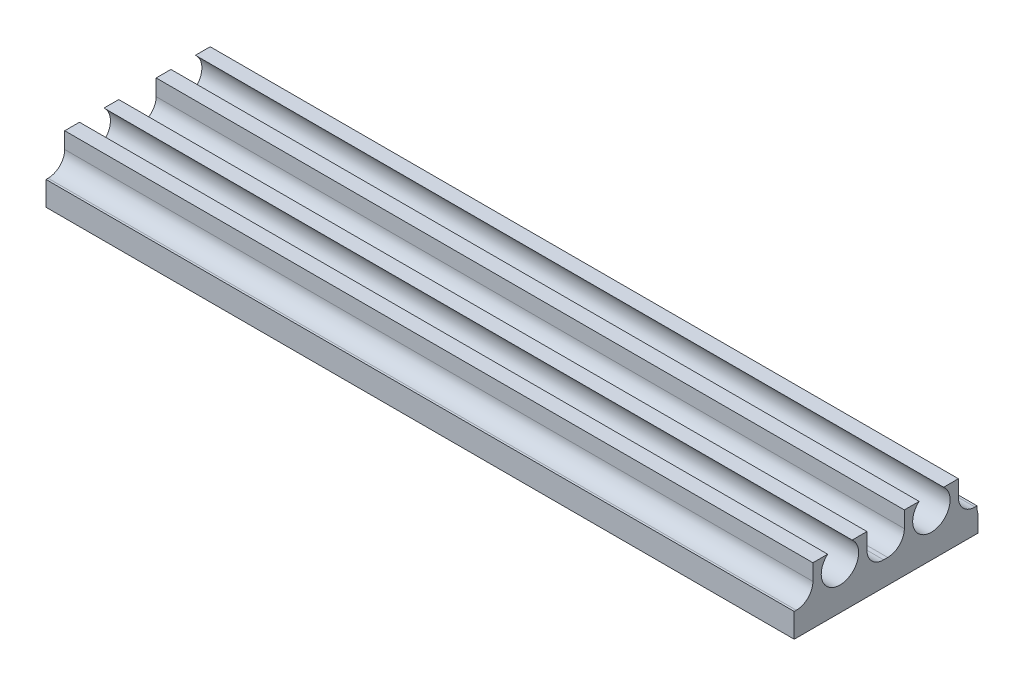
ISO-10303-21;
HEADER;
FILE_DESCRIPTION(('STEP AP214'),'2;1');
FILE_NAME('part.step','',(''),(''),'','','');
FILE_SCHEMA(('AUTOMOTIVE_DESIGN { 1 0 10303 214 1 1 1 1 }'));
ENDSEC;
DATA;
#1=APPLICATION_CONTEXT('core data for automotive mechanical design processes');
#2=APPLICATION_PROTOCOL_DEFINITION('international standard','automotive_design',2000,#1);
#3=PRODUCT_CONTEXT('',#1,'mechanical');
#4=PRODUCT('Part','Part','',(#3));
#5=PRODUCT_RELATED_PRODUCT_CATEGORY('part','',(#4));
#6=PRODUCT_DEFINITION_FORMATION('','',#4);
#7=PRODUCT_DEFINITION_CONTEXT('part definition',#1,'design');
#8=PRODUCT_DEFINITION('design','',#6,#7);
#9=PRODUCT_DEFINITION_SHAPE('','',#8);
#10=(LENGTH_UNIT() NAMED_UNIT(*) SI_UNIT(.MILLI.,.METRE.));
#11=(NAMED_UNIT(*) PLANE_ANGLE_UNIT() SI_UNIT($,.RADIAN.));
#12=(NAMED_UNIT(*) SI_UNIT($,.STERADIAN.) SOLID_ANGLE_UNIT());
#13=UNCERTAINTY_MEASURE_WITH_UNIT(LENGTH_MEASURE(1.E-05),#10,'distance_accuracy_value','');
#14=(GEOMETRIC_REPRESENTATION_CONTEXT(3) GLOBAL_UNCERTAINTY_ASSIGNED_CONTEXT((#13)) GLOBAL_UNIT_ASSIGNED_CONTEXT((#10,
#11,#12)) REPRESENTATION_CONTEXT('',''));
#15=CARTESIAN_POINT('',(0.,0.,0.));
#16=DIRECTION('',(0.,0.,1.));
#17=DIRECTION('',(1.,0.,0.));
#18=AXIS2_PLACEMENT_3D('',#15,#16,#17);
#19=CARTESIAN_POINT('',(0.,-25.7499999999933,-5.49999999999999));
#20=DIRECTION('',(1.,0.,0.));
#21=DIRECTION('',(0.,0.,-1.));
#22=AXIS2_PLACEMENT_3D('',#19,#20,#21);
#23=PLANE('',#22);
#24=CARTESIAN_POINT('',(0.,23.25,-13.));
#25=DIRECTION('',(1.,0.,0.));
#26=DIRECTION('',(0.,0.,-1.));
#27=AXIS2_PLACEMENT_3D('',#24,#25,#26);
#28=CIRCLE('',#27,2.);
#29=CARTESIAN_POINT('',(0.,23.25,-11.));
#30=VERTEX_POINT('',#29);
#31=CARTESIAN_POINT('',(0.,22.6,-11.1085719680622));
#32=VERTEX_POINT('',#31);
#33=EDGE_CURVE('E205',#30,#32,#28,.T.);
#34=ORIENTED_EDGE('',*,*,#33,.T.);
#35=DIRECTION('',(0.,1.,0.));
#36=VECTOR('',#35,1.);
#37=CARTESIAN_POINT('',(0.,20.6,-11.1085719680622));
#38=LINE('',#37,#36);
#39=CARTESIAN_POINT('',(0.,20.6,-11.1085719680622));
#40=VERTEX_POINT('',#39);
#41=EDGE_CURVE('E186',#40,#32,#38,.T.);
#42=ORIENTED_EDGE('',*,*,#41,.F.);
#43=DIRECTION('',(0.,0.,-1.));
#44=VECTOR('',#43,1.);
#45=CARTESIAN_POINT('',(0.,20.6,11.));
#46=LINE('',#45,#44);
#47=CARTESIAN_POINT('',(0.,20.6,11.));
#48=VERTEX_POINT('',#47);
#49=EDGE_CURVE('E193',#48,#40,#46,.T.);
#50=ORIENTED_EDGE('',*,*,#49,.F.);
#51=DIRECTION('',(0.,-1.,0.));
#52=VECTOR('',#51,1.);
#53=CARTESIAN_POINT('',(0.,27.4500000000069,11.));
#54=LINE('',#53,#52);
#55=CARTESIAN_POINT('',(0.,23.5,11.));
#56=VERTEX_POINT('',#55);
#57=EDGE_CURVE('E226',#56,#48,#54,.T.);
#58=ORIENTED_EDGE('',*,*,#57,.F.);
#59=DIRECTION('',(0.,0.,1.));
#60=VECTOR('',#59,1.);
#61=CARTESIAN_POINT('',(0.,23.5,8.75));
#62=LINE('',#61,#60);
#63=CARTESIAN_POINT('',(0.,23.5,10.75));
#64=VERTEX_POINT('',#63);
#65=EDGE_CURVE('E237',#64,#56,#62,.T.);
#66=ORIENTED_EDGE('',*,*,#65,.F.);
#67=CARTESIAN_POINT('',(0.,25.5,10.75));
#68=DIRECTION('',(1.,0.,0.));
#69=DIRECTION('',(0.,0.,-1.));
#70=AXIS2_PLACEMENT_3D('',#67,#68,#69);
#71=CIRCLE('',#70,2.);
#72=CARTESIAN_POINT('',(0.,25.5,8.74999999999999));
#73=VERTEX_POINT('',#72);
#74=EDGE_CURVE('E311',#64,#73,#71,.T.);
#75=ORIENTED_EDGE('',*,*,#74,.T.);
#76=DIRECTION('',(0.,-1.,0.));
#77=VECTOR('',#76,1.);
#78=CARTESIAN_POINT('',(0.,27.45,8.74999999999999));
#79=LINE('',#78,#77);
#80=CARTESIAN_POINT('',(0.,27.45,8.74999999999999));
#81=VERTEX_POINT('',#80);
#82=EDGE_CURVE('E232',#81,#73,#79,.T.);
#83=ORIENTED_EDGE('',*,*,#82,.F.);
#84=DIRECTION('',(0.,0.,1.));
#85=VECTOR('',#84,1.);
#86=CARTESIAN_POINT('',(0.,27.4500000000069,11.));
#87=LINE('',#86,#85);
#88=CARTESIAN_POINT('',(0.,27.4500000000069,6.97394029729037));
#89=VERTEX_POINT('',#88);
#90=EDGE_CURVE('E288',#89,#81,#87,.T.);
#91=ORIENTED_EDGE('',*,*,#90,.F.);
#92=CARTESIAN_POINT('',(0.,25.75,5.5));
#93=DIRECTION('',(-1.,0.,0.));
#94=DIRECTION('',(0.,0.,1.));
#95=AXIS2_PLACEMENT_3D('',#92,#93,#94);
#96=CIRCLE('',#95,2.25);
#97=CARTESIAN_POINT('',(0.,27.4500000000069,4.02605970270962));
#98=VERTEX_POINT('',#97);
#99=EDGE_CURVE('E220',#98,#89,#96,.T.);
#100=ORIENTED_EDGE('',*,*,#99,.F.);
#101=CARTESIAN_POINT('',(0.,27.45,2.25));
#102=VERTEX_POINT('',#101);
#103=EDGE_CURVE('E295',#102,#98,#87,.T.);
#104=ORIENTED_EDGE('',*,*,#103,.F.);
#105=DIRECTION('',(0.,1.,0.));
#106=VECTOR('',#105,1.);
#107=CARTESIAN_POINT('',(0.,23.5,2.25));
#108=LINE('',#107,#106);
#109=CARTESIAN_POINT('',(0.,25.5,2.25));
#110=VERTEX_POINT('',#109);
#111=EDGE_CURVE('E253',#110,#102,#108,.T.);
#112=ORIENTED_EDGE('',*,*,#111,.F.);
#113=CARTESIAN_POINT('',(0.,25.5,0.250000000000001));
#114=DIRECTION('',(1.,0.,0.));
#115=DIRECTION('',(0.,0.,-1.));
#116=AXIS2_PLACEMENT_3D('',#113,#114,#115);
#117=CIRCLE('',#116,2.);
#118=CARTESIAN_POINT('',(0.,23.5,0.250000000000001));
#119=VERTEX_POINT('',#118);
#120=EDGE_CURVE('E55',#110,#119,#117,.T.);
#121=ORIENTED_EDGE('',*,*,#120,.T.);
#122=DIRECTION('',(0.,0.,1.));
#123=VECTOR('',#122,1.);
#124=CARTESIAN_POINT('',(0.,23.5,-2.25000000000001));
#125=LINE('',#124,#123);
#126=CARTESIAN_POINT('',(0.,23.5,-0.250000000000011));
#127=VERTEX_POINT('',#126);
#128=EDGE_CURVE('E260',#127,#119,#125,.T.);
#129=ORIENTED_EDGE('',*,*,#128,.F.);
#130=CARTESIAN_POINT('',(0.,25.5,-0.250000000000011));
#131=DIRECTION('',(1.,0.,0.));
#132=DIRECTION('',(0.,0.,-1.));
#133=AXIS2_PLACEMENT_3D('',#130,#131,#132);
#134=CIRCLE('',#133,2.);
#135=CARTESIAN_POINT('',(0.,25.5,-2.25000000000001));
#136=VERTEX_POINT('',#135);
#137=EDGE_CURVE('E339',#127,#136,#134,.T.);
#138=ORIENTED_EDGE('',*,*,#137,.T.);
#139=DIRECTION('',(0.,-1.,0.));
#140=VECTOR('',#139,1.);
#141=CARTESIAN_POINT('',(0.,27.45,-2.25000000000001));
#142=LINE('',#141,#140);
#143=CARTESIAN_POINT('',(0.,27.45,-2.25000000000001));
#144=VERTEX_POINT('',#143);
#145=EDGE_CURVE('E246',#144,#136,#142,.T.);
#146=ORIENTED_EDGE('',*,*,#145,.F.);
#147=CARTESIAN_POINT('',(0.,27.4500000000069,-4.02605970270962));
#148=VERTEX_POINT('',#147);
#149=EDGE_CURVE('E294',#148,#144,#87,.T.);
#150=ORIENTED_EDGE('',*,*,#149,.F.);
#151=CARTESIAN_POINT('',(0.,25.75,-5.50000000000001));
#152=DIRECTION('',(1.,0.,0.));
#153=DIRECTION('',(0.,0.,-1.));
#154=AXIS2_PLACEMENT_3D('',#151,#152,#153);
#155=CIRCLE('',#154,2.25);
#156=CARTESIAN_POINT('',(0.,27.4500000000069,-6.9739402972904));
#157=VERTEX_POINT('',#156);
#158=EDGE_CURVE('E222',#148,#157,#155,.T.);
#159=ORIENTED_EDGE('',*,*,#158,.T.);
#160=CARTESIAN_POINT('',(0.,27.45,-8.75));
#161=VERTEX_POINT('',#160);
#162=EDGE_CURVE('E290',#161,#157,#87,.T.);
#163=ORIENTED_EDGE('',*,*,#162,.F.);
#164=DIRECTION('',(0.,1.,0.));
#165=VECTOR('',#164,1.);
#166=CARTESIAN_POINT('',(0.,23.5,-8.75000000000001));
#167=LINE('',#166,#165);
#168=CARTESIAN_POINT('',(0.,25.5,-8.75000000000001));
#169=VERTEX_POINT('',#168);
#170=EDGE_CURVE('E274',#169,#161,#167,.T.);
#171=ORIENTED_EDGE('',*,*,#170,.F.);
#172=CARTESIAN_POINT('',(0.,25.5,-10.75));
#173=DIRECTION('',(1.,0.,0.));
#174=DIRECTION('',(0.,0.,-1.));
#175=AXIS2_PLACEMENT_3D('',#172,#173,#174);
#176=CIRCLE('',#175,2.);
#177=CARTESIAN_POINT('',(0.,23.5,-10.75));
#178=VERTEX_POINT('',#177);
#179=EDGE_CURVE('E335',#169,#178,#176,.T.);
#180=ORIENTED_EDGE('',*,*,#179,.T.);
#181=DIRECTION('',(0.,0.,1.));
#182=VECTOR('',#181,1.);
#183=CARTESIAN_POINT('',(0.,23.5,-11.));
#184=LINE('',#183,#182);
#185=CARTESIAN_POINT('',(0.,23.5,-11.));
#186=VERTEX_POINT('',#185);
#187=EDGE_CURVE('E267',#186,#178,#184,.T.);
#188=ORIENTED_EDGE('',*,*,#187,.F.);
#189=DIRECTION('',(0.,1.,0.));
#190=VECTOR('',#189,1.);
#191=CARTESIAN_POINT('',(0.,21.25,-11.));
#192=LINE('',#191,#190);
#193=EDGE_CURVE('E283',#30,#186,#192,.T.);
#194=ORIENTED_EDGE('',*,*,#193,.F.);
#195=EDGE_LOOP('',(#34,#42,#50,#58,#66,#75,#83,#91,#100,#104,#112,#121,#129,#138,#146,#150,#159,
#163,#171,#180,#188,#194));
#196=FACE_BOUND('',#195,.T.);
#197=ADVANCED_FACE('F33',(#196),#23,.F.);
#198=CARTESIAN_POINT('',(90.,-25.7499999999933,-5.49999999999999));
#199=DIRECTION('',(1.,0.,0.));
#200=DIRECTION('',(0.,0.,-1.));
#201=AXIS2_PLACEMENT_3D('',#198,#199,#200);
#202=PLANE('',#201);
#203=DIRECTION('',(0.,-1.,0.));
#204=VECTOR('',#203,1.);
#205=CARTESIAN_POINT('',(90.,27.4500000000069,11.));
#206=LINE('',#205,#204);
#207=CARTESIAN_POINT('',(90.,23.5,11.));
#208=VERTEX_POINT('',#207);
#209=CARTESIAN_POINT('',(90.,20.6,11.));
#210=VERTEX_POINT('',#209);
#211=EDGE_CURVE('E299',#208,#210,#206,.T.);
#212=ORIENTED_EDGE('',*,*,#211,.T.);
#213=DIRECTION('',(0.,0.,1.));
#214=VECTOR('',#213,1.);
#215=CARTESIAN_POINT('',(90.,20.6,-11.1085719680622));
#216=LINE('',#215,#214);
#217=CARTESIAN_POINT('',(90.,20.6,-11.1085719680622));
#218=VERTEX_POINT('',#217);
#219=EDGE_CURVE('E192',#218,#210,#216,.T.);
#220=ORIENTED_EDGE('',*,*,#219,.F.);
#221=DIRECTION('',(0.,1.,0.));
#222=VECTOR('',#221,1.);
#223=CARTESIAN_POINT('',(90.,20.6,-11.1085719680622));
#224=LINE('',#223,#222);
#225=CARTESIAN_POINT('',(90.,22.6,-11.1085719680622));
#226=VERTEX_POINT('',#225);
#227=EDGE_CURVE('E188',#218,#226,#224,.T.);
#228=ORIENTED_EDGE('',*,*,#227,.T.);
#229=CARTESIAN_POINT('',(90.,23.25,-13.));
#230=DIRECTION('',(1.,0.,0.));
#231=DIRECTION('',(0.,0.,-1.));
#232=AXIS2_PLACEMENT_3D('',#229,#230,#231);
#233=CIRCLE('',#232,2.);
#234=CARTESIAN_POINT('',(90.,23.25,-11.));
#235=VERTEX_POINT('',#234);
#236=EDGE_CURVE('E333',#226,#235,#233,.F.);
#237=ORIENTED_EDGE('',*,*,#236,.T.);
#238=DIRECTION('',(0.,1.,0.));
#239=VECTOR('',#238,1.);
#240=CARTESIAN_POINT('',(90.,21.25,-11.));
#241=LINE('',#240,#239);
#242=CARTESIAN_POINT('',(90.,23.5,-11.));
#243=VERTEX_POINT('',#242);
#244=EDGE_CURVE('E286',#235,#243,#241,.T.);
#245=ORIENTED_EDGE('',*,*,#244,.T.);
#246=DIRECTION('',(0.,0.,1.));
#247=VECTOR('',#246,1.);
#248=CARTESIAN_POINT('',(90.,23.5,-11.));
#249=LINE('',#248,#247);
#250=CARTESIAN_POINT('',(90.,23.5,-10.75));
#251=VERTEX_POINT('',#250);
#252=EDGE_CURVE('E270',#243,#251,#249,.T.);
#253=ORIENTED_EDGE('',*,*,#252,.T.);
#254=CARTESIAN_POINT('',(90.,25.5,-10.75));
#255=DIRECTION('',(1.,0.,0.));
#256=DIRECTION('',(0.,0.,-1.));
#257=AXIS2_PLACEMENT_3D('',#254,#255,#256);
#258=CIRCLE('',#257,2.);
#259=CARTESIAN_POINT('',(90.,25.5,-8.75000000000001));
#260=VERTEX_POINT('',#259);
#261=EDGE_CURVE('E337',#251,#260,#258,.F.);
#262=ORIENTED_EDGE('',*,*,#261,.T.);
#263=DIRECTION('',(0.,1.,0.));
#264=VECTOR('',#263,1.);
#265=CARTESIAN_POINT('',(90.,23.5,-8.75000000000001));
#266=LINE('',#265,#264);
#267=CARTESIAN_POINT('',(90.,27.45,-8.75));
#268=VERTEX_POINT('',#267);
#269=EDGE_CURVE('E273',#260,#268,#266,.T.);
#270=ORIENTED_EDGE('',*,*,#269,.T.);
#271=DIRECTION('',(0.,0.,-1.));
#272=VECTOR('',#271,1.);
#273=CARTESIAN_POINT('',(90.,27.4500000000069,-6.74999999999995));
#274=LINE('',#273,#272);
#275=CARTESIAN_POINT('',(90.,27.4500000000069,-6.97394029729039));
#276=VERTEX_POINT('',#275);
#277=EDGE_CURVE('E293',#276,#268,#274,.T.);
#278=ORIENTED_EDGE('',*,*,#277,.F.);
#279=CARTESIAN_POINT('',(90.,25.75,-5.50000000000001));
#280=DIRECTION('',(-1.,0.,0.));
#281=DIRECTION('',(0.,0.,1.));
#282=AXIS2_PLACEMENT_3D('',#279,#280,#281);
#283=CIRCLE('',#282,2.24999999999999);
#284=CARTESIAN_POINT('',(90.,27.4500000000069,-4.02605970270964));
#285=VERTEX_POINT('',#284);
#286=EDGE_CURVE('E206',#276,#285,#283,.T.);
#287=ORIENTED_EDGE('',*,*,#286,.T.);
#288=CARTESIAN_POINT('',(90.,27.4500000000069,-2.25000000000001));
#289=VERTEX_POINT('',#288);
#290=EDGE_CURVE('E301',#289,#285,#274,.T.);
#291=ORIENTED_EDGE('',*,*,#290,.F.);
#292=DIRECTION('',(0.,-1.,0.));
#293=VECTOR('',#292,1.);
#294=CARTESIAN_POINT('',(90.,27.45,-2.25000000000001));
#295=LINE('',#294,#293);
#296=CARTESIAN_POINT('',(90.,25.5,-2.25000000000001));
#297=VERTEX_POINT('',#296);
#298=EDGE_CURVE('E249',#289,#297,#295,.T.);
#299=ORIENTED_EDGE('',*,*,#298,.T.);
#300=CARTESIAN_POINT('',(90.,25.5,-0.250000000000011));
#301=DIRECTION('',(1.,0.,0.));
#302=DIRECTION('',(0.,0.,-1.));
#303=AXIS2_PLACEMENT_3D('',#300,#301,#302);
#304=CIRCLE('',#303,2.);
#305=CARTESIAN_POINT('',(90.,23.5,-0.250000000000011));
#306=VERTEX_POINT('',#305);
#307=EDGE_CURVE('E341',#297,#306,#304,.F.);
#308=ORIENTED_EDGE('',*,*,#307,.T.);
#309=DIRECTION('',(0.,0.,1.));
#310=VECTOR('',#309,1.);
#311=CARTESIAN_POINT('',(90.,23.5,-2.25000000000001));
#312=LINE('',#311,#310);
#313=CARTESIAN_POINT('',(90.,23.5,0.250000000000001));
#314=VERTEX_POINT('',#313);
#315=EDGE_CURVE('E252',#306,#314,#312,.T.);
#316=ORIENTED_EDGE('',*,*,#315,.T.);
#317=CARTESIAN_POINT('',(90.,25.5,0.250000000000001));
#318=DIRECTION('',(1.,0.,0.));
#319=DIRECTION('',(0.,0.,-1.));
#320=AXIS2_PLACEMENT_3D('',#317,#318,#319);
#321=CIRCLE('',#320,2.);
#322=CARTESIAN_POINT('',(90.,25.5,2.25));
#323=VERTEX_POINT('',#322);
#324=EDGE_CURVE('E41',#314,#323,#321,.F.);
#325=ORIENTED_EDGE('',*,*,#324,.T.);
#326=DIRECTION('',(0.,1.,0.));
#327=VECTOR('',#326,1.);
#328=CARTESIAN_POINT('',(90.,23.5,2.25));
#329=LINE('',#328,#327);
#330=CARTESIAN_POINT('',(90.,27.45,2.25));
#331=VERTEX_POINT('',#330);
#332=EDGE_CURVE('E255',#323,#331,#329,.T.);
#333=ORIENTED_EDGE('',*,*,#332,.T.);
#334=CARTESIAN_POINT('',(90.,27.4500000000069,4.02605970270964));
#335=VERTEX_POINT('',#334);
#336=EDGE_CURVE('E300',#335,#331,#274,.T.);
#337=ORIENTED_EDGE('',*,*,#336,.F.);
#338=CARTESIAN_POINT('',(90.,25.75,5.5));
#339=DIRECTION('',(-1.,0.,0.));
#340=DIRECTION('',(0.,0.,1.));
#341=AXIS2_PLACEMENT_3D('',#338,#339,#340);
#342=CIRCLE('',#341,2.24999999999999);
#343=CARTESIAN_POINT('',(90.,27.4500000000069,6.97394029729035));
#344=VERTEX_POINT('',#343);
#345=EDGE_CURVE('E223',#335,#344,#342,.T.);
#346=ORIENTED_EDGE('',*,*,#345,.T.);
#347=CARTESIAN_POINT('',(90.,27.45,8.74999999999999));
#348=VERTEX_POINT('',#347);
#349=EDGE_CURVE('E296',#348,#344,#274,.T.);
#350=ORIENTED_EDGE('',*,*,#349,.F.);
#351=DIRECTION('',(0.,-1.,0.));
#352=VECTOR('',#351,1.);
#353=CARTESIAN_POINT('',(90.,27.45,8.74999999999999));
#354=LINE('',#353,#352);
#355=CARTESIAN_POINT('',(90.,25.5,8.74999999999999));
#356=VERTEX_POINT('',#355);
#357=EDGE_CURVE('E233',#348,#356,#354,.T.);
#358=ORIENTED_EDGE('',*,*,#357,.T.);
#359=CARTESIAN_POINT('',(90.,25.5,10.75));
#360=DIRECTION('',(1.,0.,0.));
#361=DIRECTION('',(0.,0.,-1.));
#362=AXIS2_PLACEMENT_3D('',#359,#360,#361);
#363=CIRCLE('',#362,2.);
#364=CARTESIAN_POINT('',(90.,23.5,10.75));
#365=VERTEX_POINT('',#364);
#366=EDGE_CURVE('E313',#356,#365,#363,.F.);
#367=ORIENTED_EDGE('',*,*,#366,.T.);
#368=DIRECTION('',(0.,0.,1.));
#369=VECTOR('',#368,1.);
#370=CARTESIAN_POINT('',(90.,23.5,8.75));
#371=LINE('',#370,#369);
#372=EDGE_CURVE('E236',#365,#208,#371,.T.);
#373=ORIENTED_EDGE('',*,*,#372,.T.);
#374=EDGE_LOOP('',(#212,#220,#228,#237,#245,#253,#262,#270,#278,#287,#291,#299,#308,#316,#325,
#333,#337,#346,#350,#358,#367,#373));
#375=FACE_BOUND('',#374,.T.);
#376=ADVANCED_FACE('F355',(#375),#202,.T.);
#377=CARTESIAN_POINT('',(0.,27.4500000000069,0.));
#378=DIRECTION('',(0.,-1.,0.));
#379=DIRECTION('',(0.,0.,-1.));
#380=AXIS2_PLACEMENT_3D('',#377,#378,#379);
#381=PLANE('',#380);
#382=ORIENTED_EDGE('',*,*,#290,.T.);
#383=DIRECTION('',(-1.,0.,0.));
#384=VECTOR('',#383,1.);
#385=CARTESIAN_POINT('',(0.,27.4500000000069,-4.02605970270962));
#386=LINE('',#385,#384);
#387=EDGE_CURVE('E216',#285,#148,#386,.T.);
#388=ORIENTED_EDGE('',*,*,#387,.T.);
#389=ORIENTED_EDGE('',*,*,#149,.T.);
#390=DIRECTION('',(-1.,0.,0.));
#391=VECTOR('',#390,1.);
#392=CARTESIAN_POINT('',(90.,27.45,-2.25000000000001));
#393=LINE('',#392,#391);
#394=EDGE_CURVE('E257',#289,#144,#393,.T.);
#395=ORIENTED_EDGE('',*,*,#394,.F.);
#396=EDGE_LOOP('',(#382,#388,#389,#395));
#397=FACE_BOUND('',#396,.T.);
#398=ADVANCED_FACE('F377',(#397),#381,.F.);
#399=ORIENTED_EDGE('',*,*,#349,.T.);
#400=DIRECTION('',(-1.,0.,0.));
#401=VECTOR('',#400,1.);
#402=CARTESIAN_POINT('',(0.,27.4500000000069,6.97394029729036));
#403=LINE('',#402,#401);
#404=EDGE_CURVE('E229',#344,#89,#403,.T.);
#405=ORIENTED_EDGE('',*,*,#404,.T.);
#406=ORIENTED_EDGE('',*,*,#90,.T.);
#407=DIRECTION('',(-1.,0.,0.));
#408=VECTOR('',#407,1.);
#409=CARTESIAN_POINT('',(90.,27.45,8.74999999999999));
#410=LINE('',#409,#408);
#411=EDGE_CURVE('E239',#348,#81,#410,.T.);
#412=ORIENTED_EDGE('',*,*,#411,.F.);
#413=EDGE_LOOP('',(#399,#405,#406,#412));
#414=FACE_BOUND('',#413,.T.);
#415=ADVANCED_FACE('F462',(#414),#381,.F.);
#416=ORIENTED_EDGE('',*,*,#103,.T.);
#417=DIRECTION('',(-1.,0.,0.));
#418=VECTOR('',#417,1.);
#419=CARTESIAN_POINT('',(0.,27.4500000000069,4.02605970270963));
#420=LINE('',#419,#418);
#421=EDGE_CURVE('E219',#98,#335,#420,.F.);
#422=ORIENTED_EDGE('',*,*,#421,.T.);
#423=ORIENTED_EDGE('',*,*,#336,.T.);
#424=DIRECTION('',(-1.,0.,0.));
#425=VECTOR('',#424,1.);
#426=CARTESIAN_POINT('',(90.,27.45,2.25));
#427=LINE('',#426,#425);
#428=EDGE_CURVE('E264',#331,#102,#427,.T.);
#429=ORIENTED_EDGE('',*,*,#428,.T.);
#430=EDGE_LOOP('',(#416,#422,#423,#429));
#431=FACE_BOUND('',#430,.T.);
#432=ADVANCED_FACE('F358',(#431),#381,.F.);
#433=CARTESIAN_POINT('',(90.,27.4500000000069,11.));
#434=DIRECTION('',(0.,0.,-1.));
#435=DIRECTION('',(0.,1.,0.));
#436=AXIS2_PLACEMENT_3D('',#433,#434,#435);
#437=PLANE('',#436);
#438=ORIENTED_EDGE('',*,*,#57,.T.);
#439=DIRECTION('',(-1.,0.,0.));
#440=VECTOR('',#439,1.);
#441=CARTESIAN_POINT('',(90.,20.6,11.));
#442=LINE('',#441,#440);
#443=EDGE_CURVE('E199',#210,#48,#442,.T.);
#444=ORIENTED_EDGE('',*,*,#443,.F.);
#445=ORIENTED_EDGE('',*,*,#211,.F.);
#446=DIRECTION('',(-1.,0.,0.));
#447=VECTOR('',#446,1.);
#448=CARTESIAN_POINT('',(90.,23.5,11.));
#449=LINE('',#448,#447);
#450=EDGE_CURVE('E243',#208,#56,#449,.T.);
#451=ORIENTED_EDGE('',*,*,#450,.T.);
#452=EDGE_LOOP('',(#438,#444,#445,#451));
#453=FACE_BOUND('',#452,.T.);
#454=ADVANCED_FACE('F406',(#453),#437,.F.);
#455=ORIENTED_EDGE('',*,*,#162,.T.);
#456=DIRECTION('',(-1.,0.,0.));
#457=VECTOR('',#456,1.);
#458=CARTESIAN_POINT('',(0.,27.4500000000069,-6.9739402972904));
#459=LINE('',#458,#457);
#460=EDGE_CURVE('E209',#157,#276,#459,.F.);
#461=ORIENTED_EDGE('',*,*,#460,.T.);
#462=ORIENTED_EDGE('',*,*,#277,.T.);
#463=DIRECTION('',(-1.,0.,0.));
#464=VECTOR('',#463,1.);
#465=CARTESIAN_POINT('',(90.,27.45,-8.75));
#466=LINE('',#465,#464);
#467=EDGE_CURVE('E280',#268,#161,#466,.T.);
#468=ORIENTED_EDGE('',*,*,#467,.T.);
#469=EDGE_LOOP('',(#455,#461,#462,#468));
#470=FACE_BOUND('',#469,.T.);
#471=ADVANCED_FACE('F364',(#470),#381,.F.);
#472=CARTESIAN_POINT('',(90.,21.25,-11.));
#473=DIRECTION('',(0.,0.,1.));
#474=DIRECTION('',(0.,-1.,0.));
#475=AXIS2_PLACEMENT_3D('',#472,#473,#474);
#476=PLANE('',#475);
#477=ORIENTED_EDGE('',*,*,#244,.F.);
#478=DIRECTION('',(-1.,0.,0.));
#479=VECTOR('',#478,1.);
#480=CARTESIAN_POINT('',(0.,23.25,-11.));
#481=LINE('',#480,#479);
#482=EDGE_CURVE('E315',#235,#30,#481,.T.);
#483=ORIENTED_EDGE('',*,*,#482,.T.);
#484=ORIENTED_EDGE('',*,*,#193,.T.);
#485=DIRECTION('',(-1.,0.,0.));
#486=VECTOR('',#485,1.);
#487=CARTESIAN_POINT('',(90.,23.5,-11.));
#488=LINE('',#487,#486);
#489=EDGE_CURVE('E276',#243,#186,#488,.T.);
#490=ORIENTED_EDGE('',*,*,#489,.F.);
#491=EDGE_LOOP('',(#477,#483,#484,#490));
#492=FACE_BOUND('',#491,.T.);
#493=ADVANCED_FACE('F452',(#492),#476,.F.);
#494=CARTESIAN_POINT('',(90.,23.5,-8.75000000000001));
#495=DIRECTION('',(0.,0.,1.));
#496=DIRECTION('',(0.,-1.,0.));
#497=AXIS2_PLACEMENT_3D('',#494,#495,#496);
#498=PLANE('',#497);
#499=ORIENTED_EDGE('',*,*,#269,.F.);
#500=DIRECTION('',(-1.,0.,0.));
#501=VECTOR('',#500,1.);
#502=CARTESIAN_POINT('',(0.,25.5,-8.75000000000001));
#503=LINE('',#502,#501);
#504=EDGE_CURVE('E318',#260,#169,#503,.T.);
#505=ORIENTED_EDGE('',*,*,#504,.T.);
#506=ORIENTED_EDGE('',*,*,#170,.T.);
#507=ORIENTED_EDGE('',*,*,#467,.F.);
#508=EDGE_LOOP('',(#499,#505,#506,#507));
#509=FACE_BOUND('',#508,.T.);
#510=ADVANCED_FACE('F368',(#509),#498,.F.);
#511=CARTESIAN_POINT('',(90.,23.5,-11.));
#512=DIRECTION('',(0.,-1.,0.));
#513=DIRECTION('',(0.,0.,-1.));
#514=AXIS2_PLACEMENT_3D('',#511,#512,#513);
#515=PLANE('',#514);
#516=ORIENTED_EDGE('',*,*,#187,.T.);
#517=DIRECTION('',(-1.,0.,0.));
#518=VECTOR('',#517,1.);
#519=CARTESIAN_POINT('',(90.,23.5,-10.75));
#520=LINE('',#519,#518);
#521=EDGE_CURVE('E321',#178,#251,#520,.F.);
#522=ORIENTED_EDGE('',*,*,#521,.T.);
#523=ORIENTED_EDGE('',*,*,#252,.F.);
#524=ORIENTED_EDGE('',*,*,#489,.T.);
#525=EDGE_LOOP('',(#516,#522,#523,#524));
#526=FACE_BOUND('',#525,.T.);
#527=ADVANCED_FACE('F443',(#526),#515,.F.);
#528=CARTESIAN_POINT('',(90.,23.5,2.25));
#529=DIRECTION('',(0.,0.,1.));
#530=DIRECTION('',(1.,0.,0.));
#531=AXIS2_PLACEMENT_3D('',#528,#529,#530);
#532=PLANE('',#531);
#533=ORIENTED_EDGE('',*,*,#332,.F.);
#534=DIRECTION('',(-1.,0.,0.));
#535=VECTOR('',#534,1.);
#536=CARTESIAN_POINT('',(0.,25.5,2.25));
#537=LINE('',#536,#535);
#538=EDGE_CURVE('E330',#323,#110,#537,.T.);
#539=ORIENTED_EDGE('',*,*,#538,.T.);
#540=ORIENTED_EDGE('',*,*,#111,.T.);
#541=ORIENTED_EDGE('',*,*,#428,.F.);
#542=EDGE_LOOP('',(#533,#539,#540,#541));
#543=FACE_BOUND('',#542,.T.);
#544=ADVANCED_FACE('F351',(#543),#532,.F.);
#545=CARTESIAN_POINT('',(90.,23.5,-2.25000000000001));
#546=DIRECTION('',(0.,-1.,0.));
#547=DIRECTION('',(0.,0.,-1.));
#548=AXIS2_PLACEMENT_3D('',#545,#546,#547);
#549=PLANE('',#548);
#550=ORIENTED_EDGE('',*,*,#315,.F.);
#551=DIRECTION('',(-1.,0.,0.));
#552=VECTOR('',#551,1.);
#553=CARTESIAN_POINT('',(0.,23.5,-0.250000000000011));
#554=LINE('',#553,#552);
#555=EDGE_CURVE('E325',#306,#127,#554,.T.);
#556=ORIENTED_EDGE('',*,*,#555,.T.);
#557=ORIENTED_EDGE('',*,*,#128,.T.);
#558=DIRECTION('',(-1.,0.,0.));
#559=VECTOR('',#558,1.);
#560=CARTESIAN_POINT('',(90.,23.5,0.250000000000001));
#561=LINE('',#560,#559);
#562=EDGE_CURVE('E323',#119,#314,#561,.F.);
#563=ORIENTED_EDGE('',*,*,#562,.T.);
#564=EDGE_LOOP('',(#550,#556,#557,#563));
#565=FACE_BOUND('',#564,.T.);
#566=ADVANCED_FACE('F348',(#565),#549,.F.);
#567=CARTESIAN_POINT('',(90.,27.45,-2.25000000000001));
#568=DIRECTION('',(0.,0.,-1.));
#569=DIRECTION('',(0.,1.,0.));
#570=AXIS2_PLACEMENT_3D('',#567,#568,#569);
#571=PLANE('',#570);
#572=ORIENTED_EDGE('',*,*,#145,.T.);
#573=DIRECTION('',(-1.,0.,0.));
#574=VECTOR('',#573,1.);
#575=CARTESIAN_POINT('',(90.,25.5,-2.25000000000001));
#576=LINE('',#575,#574);
#577=EDGE_CURVE('E328',#136,#297,#576,.F.);
#578=ORIENTED_EDGE('',*,*,#577,.T.);
#579=ORIENTED_EDGE('',*,*,#298,.F.);
#580=ORIENTED_EDGE('',*,*,#394,.T.);
#581=EDGE_LOOP('',(#572,#578,#579,#580));
#582=FACE_BOUND('',#581,.T.);
#583=ADVANCED_FACE('F385',(#582),#571,.F.);
#584=CARTESIAN_POINT('',(90.,23.5,8.75));
#585=DIRECTION('',(0.,-1.,0.));
#586=DIRECTION('',(0.,0.,-1.));
#587=AXIS2_PLACEMENT_3D('',#584,#585,#586);
#588=PLANE('',#587);
#589=ORIENTED_EDGE('',*,*,#372,.F.);
#590=DIRECTION('',(-1.,0.,0.));
#591=VECTOR('',#590,1.);
#592=CARTESIAN_POINT('',(0.,23.5,10.75));
#593=LINE('',#592,#591);
#594=EDGE_CURVE('E306',#365,#64,#593,.T.);
#595=ORIENTED_EDGE('',*,*,#594,.T.);
#596=ORIENTED_EDGE('',*,*,#65,.T.);
#597=ORIENTED_EDGE('',*,*,#450,.F.);
#598=EDGE_LOOP('',(#589,#595,#596,#597));
#599=FACE_BOUND('',#598,.T.);
#600=ADVANCED_FACE('F387',(#599),#588,.F.);
#601=CARTESIAN_POINT('',(90.,27.45,8.74999999999999));
#602=DIRECTION('',(0.,0.,-1.));
#603=DIRECTION('',(0.,1.,0.));
#604=AXIS2_PLACEMENT_3D('',#601,#602,#603);
#605=PLANE('',#604);
#606=ORIENTED_EDGE('',*,*,#82,.T.);
#607=DIRECTION('',(-1.,0.,0.));
#608=VECTOR('',#607,1.);
#609=CARTESIAN_POINT('',(90.,25.5,8.74999999999999));
#610=LINE('',#609,#608);
#611=EDGE_CURVE('E309',#73,#356,#610,.F.);
#612=ORIENTED_EDGE('',*,*,#611,.T.);
#613=ORIENTED_EDGE('',*,*,#357,.F.);
#614=ORIENTED_EDGE('',*,*,#411,.T.);
#615=EDGE_LOOP('',(#606,#612,#613,#614));
#616=FACE_BOUND('',#615,.T.);
#617=ADVANCED_FACE('F393',(#616),#605,.F.);
#618=CARTESIAN_POINT('',(0.,25.75,5.5));
#619=DIRECTION('',(-1.,0.,0.));
#620=DIRECTION('',(0.,0.,1.));
#621=AXIS2_PLACEMENT_3D('',#618,#619,#620);
#622=CYLINDRICAL_SURFACE('',#621,2.25);
#623=ORIENTED_EDGE('',*,*,#345,.F.);
#624=ORIENTED_EDGE('',*,*,#421,.F.);
#625=ORIENTED_EDGE('',*,*,#99,.T.);
#626=ORIENTED_EDGE('',*,*,#404,.F.);
#627=EDGE_LOOP('',(#623,#624,#625,#626));
#628=FACE_BOUND('',#627,.T.);
#629=ADVANCED_FACE('F435',(#628),#622,.F.);
#630=CARTESIAN_POINT('',(0.,25.75,-5.50000000000001));
#631=DIRECTION('',(-1.,0.,0.));
#632=DIRECTION('',(0.,0.,1.));
#633=AXIS2_PLACEMENT_3D('',#630,#631,#632);
#634=CYLINDRICAL_SURFACE('',#633,2.25);
#635=ORIENTED_EDGE('',*,*,#286,.F.);
#636=ORIENTED_EDGE('',*,*,#460,.F.);
#637=ORIENTED_EDGE('',*,*,#158,.F.);
#638=ORIENTED_EDGE('',*,*,#387,.F.);
#639=EDGE_LOOP('',(#635,#636,#637,#638));
#640=FACE_BOUND('',#639,.T.);
#641=ADVANCED_FACE('F375',(#640),#634,.F.);
#642=CARTESIAN_POINT('',(90.,25.5,10.75));
#643=DIRECTION('',(1.,0.,0.));
#644=DIRECTION('',(0.,0.,-1.));
#645=AXIS2_PLACEMENT_3D('',#642,#643,#644);
#646=CYLINDRICAL_SURFACE('',#645,2.);
#647=ORIENTED_EDGE('',*,*,#366,.F.);
#648=ORIENTED_EDGE('',*,*,#611,.F.);
#649=ORIENTED_EDGE('',*,*,#74,.F.);
#650=ORIENTED_EDGE('',*,*,#594,.F.);
#651=EDGE_LOOP('',(#647,#648,#649,#650));
#652=FACE_BOUND('',#651,.T.);
#653=ADVANCED_FACE('F409',(#652),#646,.F.);
#654=CARTESIAN_POINT('',(90.,23.25,-13.));
#655=DIRECTION('',(1.,0.,0.));
#656=DIRECTION('',(0.,0.,-1.));
#657=AXIS2_PLACEMENT_3D('',#654,#655,#656);
#658=CYLINDRICAL_SURFACE('',#657,2.);
#659=ORIENTED_EDGE('',*,*,#236,.F.);
#660=DIRECTION('',(1.,0.,0.));
#661=VECTOR('',#660,1.);
#662=CARTESIAN_POINT('',(90.,22.6,-11.1085719680622));
#663=LINE('',#662,#661);
#664=EDGE_CURVE('E11',#226,#32,#663,.F.);
#665=ORIENTED_EDGE('',*,*,#664,.T.);
#666=ORIENTED_EDGE('',*,*,#33,.F.);
#667=ORIENTED_EDGE('',*,*,#482,.F.);
#668=EDGE_LOOP('',(#659,#665,#666,#667));
#669=FACE_BOUND('',#668,.T.);
#670=ADVANCED_FACE('F412',(#669),#658,.F.);
#671=CARTESIAN_POINT('',(90.,25.5,-10.75));
#672=DIRECTION('',(1.,0.,0.));
#673=DIRECTION('',(0.,0.,-1.));
#674=AXIS2_PLACEMENT_3D('',#671,#672,#673);
#675=CYLINDRICAL_SURFACE('',#674,2.);
#676=ORIENTED_EDGE('',*,*,#261,.F.);
#677=ORIENTED_EDGE('',*,*,#521,.F.);
#678=ORIENTED_EDGE('',*,*,#179,.F.);
#679=ORIENTED_EDGE('',*,*,#504,.F.);
#680=EDGE_LOOP('',(#676,#677,#678,#679));
#681=FACE_BOUND('',#680,.T.);
#682=ADVANCED_FACE('F416',(#681),#675,.F.);
#683=CARTESIAN_POINT('',(90.,25.5,-0.250000000000011));
#684=DIRECTION('',(1.,0.,0.));
#685=DIRECTION('',(0.,0.,-1.));
#686=AXIS2_PLACEMENT_3D('',#683,#684,#685);
#687=CYLINDRICAL_SURFACE('',#686,2.);
#688=ORIENTED_EDGE('',*,*,#307,.F.);
#689=ORIENTED_EDGE('',*,*,#577,.F.);
#690=ORIENTED_EDGE('',*,*,#137,.F.);
#691=ORIENTED_EDGE('',*,*,#555,.F.);
#692=EDGE_LOOP('',(#688,#689,#690,#691));
#693=FACE_BOUND('',#692,.T.);
#694=ADVANCED_FACE('F384',(#693),#687,.F.);
#695=CARTESIAN_POINT('',(90.,25.5,0.250000000000001));
#696=DIRECTION('',(1.,0.,0.));
#697=DIRECTION('',(0.,0.,-1.));
#698=AXIS2_PLACEMENT_3D('',#695,#696,#697);
#699=CYLINDRICAL_SURFACE('',#698,2.);
#700=ORIENTED_EDGE('',*,*,#324,.F.);
#701=ORIENTED_EDGE('',*,*,#562,.F.);
#702=ORIENTED_EDGE('',*,*,#120,.F.);
#703=ORIENTED_EDGE('',*,*,#538,.F.);
#704=EDGE_LOOP('',(#700,#701,#702,#703));
#705=FACE_BOUND('',#704,.T.);
#706=ADVANCED_FACE('F35',(#705),#699,.F.);
#707=CARTESIAN_POINT('',(0.,20.6,-11.1085719680622));
#708=DIRECTION('',(0.,0.,1.));
#709=DIRECTION('',(1.,0.,0.));
#710=AXIS2_PLACEMENT_3D('',#707,#708,#709);
#711=PLANE('',#710);
#712=ORIENTED_EDGE('',*,*,#664,.F.);
#713=ORIENTED_EDGE('',*,*,#227,.F.);
#714=DIRECTION('',(1.,0.,0.));
#715=VECTOR('',#714,1.);
#716=CARTESIAN_POINT('',(0.,20.6,-11.1085719680622));
#717=LINE('',#716,#715);
#718=EDGE_CURVE('E182',#40,#218,#717,.T.);
#719=ORIENTED_EDGE('',*,*,#718,.F.);
#720=ORIENTED_EDGE('',*,*,#41,.T.);
#721=EDGE_LOOP('',(#712,#713,#719,#720));
#722=FACE_BOUND('',#721,.T.);
#723=ADVANCED_FACE('F184',(#722),#711,.F.);
#724=CARTESIAN_POINT('',(0.,20.6,0.));
#725=DIRECTION('',(0.,-1.,0.));
#726=DIRECTION('',(0.,0.,-1.));
#727=AXIS2_PLACEMENT_3D('',#724,#725,#726);
#728=PLANE('',#727);
#729=ORIENTED_EDGE('',*,*,#49,.T.);
#730=ORIENTED_EDGE('',*,*,#718,.T.);
#731=ORIENTED_EDGE('',*,*,#219,.T.);
#732=ORIENTED_EDGE('',*,*,#443,.T.);
#733=EDGE_LOOP('',(#729,#730,#731,#732));
#734=FACE_BOUND('',#733,.T.);
#735=ADVANCED_FACE('F197',(#734),#728,.T.);
#736=CLOSED_SHELL('',(#197,#376,#398,#415,#432,#454,#471,#493,#510,#527,#544,#566,#583,#600,
#617,#629,#641,#653,#670,#682,#694,#706,#723,#735));
#737=MANIFOLD_SOLID_BREP('B2',#736);
#738=ADVANCED_BREP_SHAPE_REPRESENTATION('',(#18,#737),#14);
#739=SHAPE_DEFINITION_REPRESENTATION(#9,#738);
ENDSEC;
END-ISO-10303-21;
